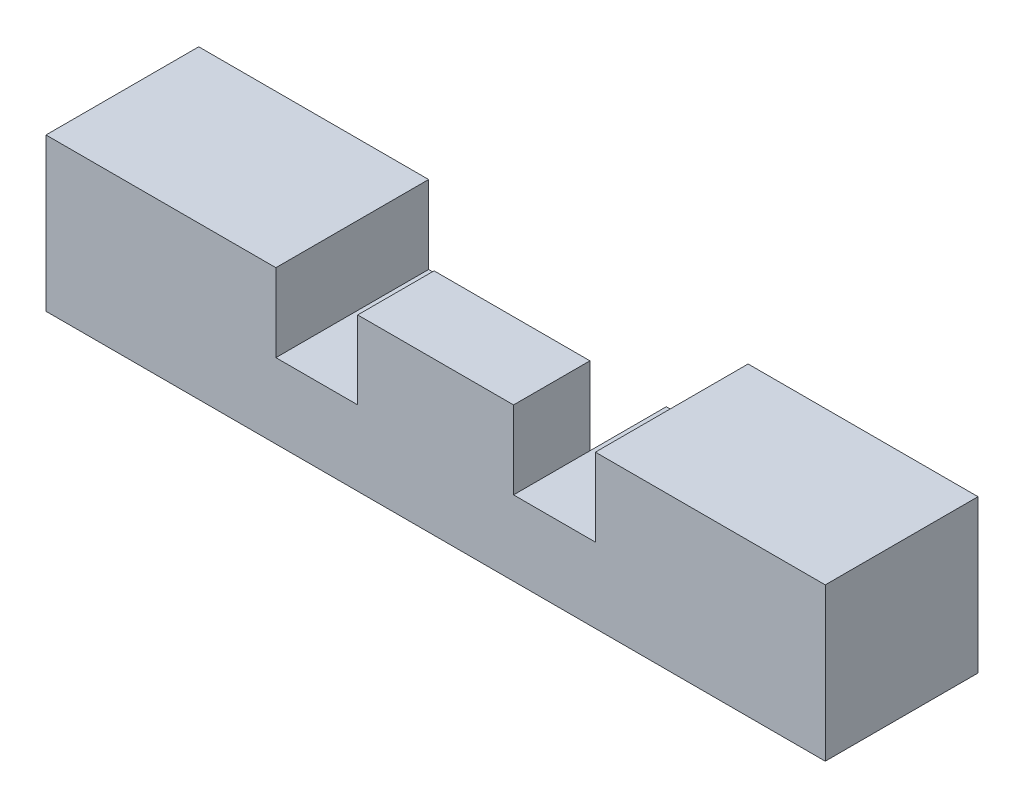
ISO-10303-21;
HEADER;
FILE_DESCRIPTION(('STEP AP214'),'2;1');
FILE_NAME('part.step','',(''),(''),'','','');
FILE_SCHEMA(('AUTOMOTIVE_DESIGN { 1 0 10303 214 1 1 1 1 }'));
ENDSEC;
DATA;
#1=APPLICATION_CONTEXT('core data for automotive mechanical design processes');
#2=APPLICATION_PROTOCOL_DEFINITION('international standard','automotive_design',2000,#1);
#3=PRODUCT_CONTEXT('',#1,'mechanical');
#4=PRODUCT('Part','Part','',(#3));
#5=PRODUCT_RELATED_PRODUCT_CATEGORY('part','',(#4));
#6=PRODUCT_DEFINITION_FORMATION('','',#4);
#7=PRODUCT_DEFINITION_CONTEXT('part definition',#1,'design');
#8=PRODUCT_DEFINITION('design','',#6,#7);
#9=PRODUCT_DEFINITION_SHAPE('','',#8);
#10=(LENGTH_UNIT() NAMED_UNIT(*) SI_UNIT(.MILLI.,.METRE.));
#11=(NAMED_UNIT(*) PLANE_ANGLE_UNIT() SI_UNIT($,.RADIAN.));
#12=(NAMED_UNIT(*) SI_UNIT($,.STERADIAN.) SOLID_ANGLE_UNIT());
#13=UNCERTAINTY_MEASURE_WITH_UNIT(LENGTH_MEASURE(1.E-05),#10,'distance_accuracy_value','');
#14=(GEOMETRIC_REPRESENTATION_CONTEXT(3) GLOBAL_UNCERTAINTY_ASSIGNED_CONTEXT((#13)) GLOBAL_UNIT_ASSIGNED_CONTEXT((#10,
#11,#12)) REPRESENTATION_CONTEXT('',''));
#15=CARTESIAN_POINT('',(0.,0.,0.));
#16=DIRECTION('',(0.,0.,1.));
#17=DIRECTION('',(1.,0.,0.));
#18=AXIS2_PLACEMENT_3D('',#15,#16,#17);
#19=CARTESIAN_POINT('',(-50.,9.8,19.6));
#20=DIRECTION('',(1.,0.,0.));
#21=DIRECTION('',(0.,0.,-1.));
#22=AXIS2_PLACEMENT_3D('',#19,#20,#21);
#23=PLANE('',#22);
#24=DIRECTION('',(0.,-1.,0.));
#25=VECTOR('',#24,1.);
#26=CARTESIAN_POINT('',(-50.,9.8,0.));
#27=LINE('',#26,#25);
#28=CARTESIAN_POINT('',(-50.,9.8,0.));
#29=VERTEX_POINT('',#28);
#30=CARTESIAN_POINT('',(-50.,-9.8,0.));
#31=VERTEX_POINT('',#30);
#32=EDGE_CURVE('E463',#29,#31,#27,.T.);
#33=ORIENTED_EDGE('',*,*,#32,.T.);
#34=DIRECTION('',(0.,0.,-1.));
#35=VECTOR('',#34,1.);
#36=CARTESIAN_POINT('',(-50.,-9.8,19.6));
#37=LINE('',#36,#35);
#38=CARTESIAN_POINT('',(-50.,-9.8,19.6));
#39=VERTEX_POINT('',#38);
#40=EDGE_CURVE('E470',#39,#31,#37,.T.);
#41=ORIENTED_EDGE('',*,*,#40,.F.);
#42=DIRECTION('',(0.,-1.,0.));
#43=VECTOR('',#42,1.);
#44=CARTESIAN_POINT('',(-50.,9.8,19.6));
#45=LINE('',#44,#43);
#46=CARTESIAN_POINT('',(-50.,9.8,19.6));
#47=VERTEX_POINT('',#46);
#48=EDGE_CURVE('E452',#47,#39,#45,.T.);
#49=ORIENTED_EDGE('',*,*,#48,.F.);
#50=DIRECTION('',(0.,0.,-1.));
#51=VECTOR('',#50,1.);
#52=CARTESIAN_POINT('',(-50.,9.8,19.6));
#53=LINE('',#52,#51);
#54=EDGE_CURVE('E473',#47,#29,#53,.T.);
#55=ORIENTED_EDGE('',*,*,#54,.T.);
#56=EDGE_LOOP('',(#33,#41,#49,#55));
#57=FACE_BOUND('',#56,.T.);
#58=ADVANCED_FACE('F34',(#57),#23,.F.);
#59=CARTESIAN_POINT('',(0.,-0.199999999999999,0.));
#60=DIRECTION('',(0.,-1.,0.));
#61=DIRECTION('',(0.,0.,-1.));
#62=AXIS2_PLACEMENT_3D('',#59,#60,#61);
#63=PLANE('',#62);
#64=DIRECTION('',(0.,0.,1.));
#65=VECTOR('',#64,1.);
#66=CARTESIAN_POINT('',(-10.,-0.199999999999999,9.8));
#67=LINE('',#66,#65);
#68=CARTESIAN_POINT('',(-10.,-0.199999999999999,9.8));
#69=VERTEX_POINT('',#68);
#70=CARTESIAN_POINT('',(-10.,-0.199999999999999,19.6));
#71=VERTEX_POINT('',#70);
#72=EDGE_CURVE('E370',#69,#71,#67,.T.);
#73=ORIENTED_EDGE('',*,*,#72,.F.);
#74=DIRECTION('',(0.,0.,-1.));
#75=VECTOR('',#74,1.);
#76=CARTESIAN_POINT('',(-10.,-0.199999999999999,0.));
#77=LINE('',#76,#75);
#78=CARTESIAN_POINT('',(-10.,-0.199999999999999,0.));
#79=VERTEX_POINT('',#78);
#80=EDGE_CURVE('E11',#69,#79,#77,.T.);
#81=ORIENTED_EDGE('',*,*,#80,.T.);
#82=DIRECTION('',(-1.,0.,0.));
#83=VECTOR('',#82,1.);
#84=CARTESIAN_POINT('',(20.5,-0.199999999999999,0.));
#85=LINE('',#84,#83);
#86=CARTESIAN_POINT('',(-20.5,-0.199999999999999,0.));
#87=VERTEX_POINT('',#86);
#88=EDGE_CURVE('E427',#79,#87,#85,.T.);
#89=ORIENTED_EDGE('',*,*,#88,.T.);
#90=DIRECTION('',(0.,0.,1.));
#91=VECTOR('',#90,1.);
#92=CARTESIAN_POINT('',(-20.5,-0.199999999999999,0.));
#93=LINE('',#92,#91);
#94=CARTESIAN_POINT('',(-20.5,-0.199999999999999,19.6));
#95=VERTEX_POINT('',#94);
#96=EDGE_CURVE('E417',#87,#95,#93,.T.);
#97=ORIENTED_EDGE('',*,*,#96,.T.);
#98=DIRECTION('',(1.,0.,0.));
#99=VECTOR('',#98,1.);
#100=CARTESIAN_POINT('',(20.5,-0.199999999999999,19.6));
#101=LINE('',#100,#99);
#102=EDGE_CURVE('E422',#95,#71,#101,.T.);
#103=ORIENTED_EDGE('',*,*,#102,.T.);
#104=EDGE_LOOP('',(#73,#81,#89,#97,#103));
#105=FACE_BOUND('',#104,.T.);
#106=ADVANCED_FACE('F528',(#105),#63,.F.);
#107=DIRECTION('',(0.,0.,-1.));
#108=VECTOR('',#107,1.);
#109=CARTESIAN_POINT('',(10.,-0.199999999999999,9.8));
#110=LINE('',#109,#108);
#111=CARTESIAN_POINT('',(10.,-0.199999999999999,19.6));
#112=VERTEX_POINT('',#111);
#113=CARTESIAN_POINT('',(10.,-0.199999999999999,9.8));
#114=VERTEX_POINT('',#113);
#115=EDGE_CURVE('E375',#112,#114,#110,.T.);
#116=ORIENTED_EDGE('',*,*,#115,.F.);
#117=CARTESIAN_POINT('',(20.5,-0.199999999999999,19.6));
#118=VERTEX_POINT('',#117);
#119=EDGE_CURVE('E420',#112,#118,#101,.T.);
#120=ORIENTED_EDGE('',*,*,#119,.T.);
#121=DIRECTION('',(0.,0.,-1.));
#122=VECTOR('',#121,1.);
#123=CARTESIAN_POINT('',(20.5,-0.199999999999999,0.));
#124=LINE('',#123,#122);
#125=CARTESIAN_POINT('',(20.5,-0.199999999999999,0.));
#126=VERTEX_POINT('',#125);
#127=EDGE_CURVE('E425',#118,#126,#124,.T.);
#128=ORIENTED_EDGE('',*,*,#127,.T.);
#129=CARTESIAN_POINT('',(10.,-0.199999999999999,0.));
#130=VERTEX_POINT('',#129);
#131=EDGE_CURVE('E428',#126,#130,#85,.T.);
#132=ORIENTED_EDGE('',*,*,#131,.T.);
#133=DIRECTION('',(0.,0.,-1.));
#134=VECTOR('',#133,1.);
#135=CARTESIAN_POINT('',(10.,-0.199999999999999,-9.8));
#136=LINE('',#135,#134);
#137=EDGE_CURVE('E393',#114,#130,#136,.T.);
#138=ORIENTED_EDGE('',*,*,#137,.F.);
#139=EDGE_LOOP('',(#116,#120,#128,#132,#138));
#140=FACE_BOUND('',#139,.T.);
#141=ADVANCED_FACE('F517',(#140),#63,.F.);
#142=CARTESIAN_POINT('',(0.,0.,0.));
#143=DIRECTION('',(0.,0.,1.));
#144=DIRECTION('',(1.,0.,0.));
#145=AXIS2_PLACEMENT_3D('',#142,#143,#144);
#146=PLANE('',#145);
#147=DIRECTION('',(1.,0.,0.));
#148=VECTOR('',#147,1.);
#149=CARTESIAN_POINT('',(-50.,-9.8,0.));
#150=LINE('',#149,#148);
#151=CARTESIAN_POINT('',(10.,-9.8,0.));
#152=VERTEX_POINT('',#151);
#153=CARTESIAN_POINT('',(50.,-9.8,0.));
#154=VERTEX_POINT('',#153);
#155=EDGE_CURVE('E465',#152,#154,#150,.T.);
#156=ORIENTED_EDGE('',*,*,#155,.F.);
#157=DIRECTION('',(0.,1.,0.));
#158=VECTOR('',#157,1.);
#159=CARTESIAN_POINT('',(10.,0.,0.));
#160=LINE('',#159,#158);
#161=EDGE_CURVE('E410',#152,#130,#160,.T.);
#162=ORIENTED_EDGE('',*,*,#161,.T.);
#163=ORIENTED_EDGE('',*,*,#131,.F.);
#164=DIRECTION('',(0.,1.,0.));
#165=VECTOR('',#164,1.);
#166=CARTESIAN_POINT('',(20.5,-0.199999999999999,0.));
#167=LINE('',#166,#165);
#168=CARTESIAN_POINT('',(20.5,9.8,0.));
#169=VERTEX_POINT('',#168);
#170=EDGE_CURVE('E437',#126,#169,#167,.T.);
#171=ORIENTED_EDGE('',*,*,#170,.T.);
#172=DIRECTION('',(-1.,0.,0.));
#173=VECTOR('',#172,1.);
#174=CARTESIAN_POINT('',(-50.,9.8,0.));
#175=LINE('',#174,#173);
#176=CARTESIAN_POINT('',(50.,9.8,0.));
#177=VERTEX_POINT('',#176);
#178=EDGE_CURVE('E460',#177,#169,#175,.T.);
#179=ORIENTED_EDGE('',*,*,#178,.F.);
#180=DIRECTION('',(0.,1.,0.));
#181=VECTOR('',#180,1.);
#182=CARTESIAN_POINT('',(50.,9.8,0.));
#183=LINE('',#182,#181);
#184=EDGE_CURVE('E436',#154,#177,#183,.T.);
#185=ORIENTED_EDGE('',*,*,#184,.F.);
#186=EDGE_LOOP('',(#156,#162,#163,#171,#179,#185));
#187=FACE_BOUND('',#186,.T.);
#188=ADVANCED_FACE('F486',(#187),#146,.F.);
#189=CARTESIAN_POINT('',(-50.,9.8,19.6));
#190=DIRECTION('',(0.,-1.,0.));
#191=DIRECTION('',(0.,0.,-1.));
#192=AXIS2_PLACEMENT_3D('',#189,#190,#191);
#193=PLANE('',#192);
#194=DIRECTION('',(-1.,0.,0.));
#195=VECTOR('',#194,1.);
#196=CARTESIAN_POINT('',(-50.,9.8,19.6));
#197=LINE('',#196,#195);
#198=CARTESIAN_POINT('',(-20.5,9.8,19.6));
#199=VERTEX_POINT('',#198);
#200=EDGE_CURVE('E447',#199,#47,#197,.T.);
#201=ORIENTED_EDGE('',*,*,#200,.F.);
#202=DIRECTION('',(0.,0.,1.));
#203=VECTOR('',#202,1.);
#204=CARTESIAN_POINT('',(-20.5,9.8,0.));
#205=LINE('',#204,#203);
#206=CARTESIAN_POINT('',(-20.5,9.8,0.));
#207=VERTEX_POINT('',#206);
#208=EDGE_CURVE('E416',#207,#199,#205,.T.);
#209=ORIENTED_EDGE('',*,*,#208,.F.);
#210=EDGE_CURVE('E459',#207,#29,#175,.T.);
#211=ORIENTED_EDGE('',*,*,#210,.T.);
#212=ORIENTED_EDGE('',*,*,#54,.F.);
#213=EDGE_LOOP('',(#201,#209,#211,#212));
#214=FACE_BOUND('',#213,.T.);
#215=ADVANCED_FACE('F542',(#214),#193,.F.);
#216=CARTESIAN_POINT('',(50.,9.8,19.6));
#217=DIRECTION('',(-1.,0.,0.));
#218=DIRECTION('',(0.,0.,1.));
#219=AXIS2_PLACEMENT_3D('',#216,#217,#218);
#220=PLANE('',#219);
#221=ORIENTED_EDGE('',*,*,#184,.T.);
#222=DIRECTION('',(0.,0.,-1.));
#223=VECTOR('',#222,1.);
#224=CARTESIAN_POINT('',(50.,9.8,19.6));
#225=LINE('',#224,#223);
#226=CARTESIAN_POINT('',(50.,9.8,19.6));
#227=VERTEX_POINT('',#226);
#228=EDGE_CURVE('E43',#227,#177,#225,.T.);
#229=ORIENTED_EDGE('',*,*,#228,.F.);
#230=DIRECTION('',(0.,1.,0.));
#231=VECTOR('',#230,1.);
#232=CARTESIAN_POINT('',(50.,9.8,19.6));
#233=LINE('',#232,#231);
#234=CARTESIAN_POINT('',(50.,-9.8,19.6));
#235=VERTEX_POINT('',#234);
#236=EDGE_CURVE('E444',#235,#227,#233,.T.);
#237=ORIENTED_EDGE('',*,*,#236,.F.);
#238=DIRECTION('',(0.,0.,-1.));
#239=VECTOR('',#238,1.);
#240=CARTESIAN_POINT('',(50.,-9.8,19.6));
#241=LINE('',#240,#239);
#242=EDGE_CURVE('E456',#235,#154,#241,.T.);
#243=ORIENTED_EDGE('',*,*,#242,.T.);
#244=EDGE_LOOP('',(#221,#229,#237,#243));
#245=FACE_BOUND('',#244,.T.);
#246=ADVANCED_FACE('F36',(#245),#220,.F.);
#247=ORIENTED_EDGE('',*,*,#178,.T.);
#248=DIRECTION('',(0.,0.,-1.));
#249=VECTOR('',#248,1.);
#250=CARTESIAN_POINT('',(20.5,9.8,0.));
#251=LINE('',#250,#249);
#252=CARTESIAN_POINT('',(20.5,9.8,19.6));
#253=VERTEX_POINT('',#252);
#254=EDGE_CURVE('E421',#253,#169,#251,.T.);
#255=ORIENTED_EDGE('',*,*,#254,.F.);
#256=EDGE_CURVE('E449',#227,#253,#197,.T.);
#257=ORIENTED_EDGE('',*,*,#256,.F.);
#258=ORIENTED_EDGE('',*,*,#228,.T.);
#259=EDGE_LOOP('',(#247,#255,#257,#258));
#260=FACE_BOUND('',#259,.T.);
#261=ADVANCED_FACE('F478',(#260),#193,.F.);
#262=CARTESIAN_POINT('',(-50.,-9.8,19.6));
#263=DIRECTION('',(0.,1.,0.));
#264=DIRECTION('',(0.,0.,1.));
#265=AXIS2_PLACEMENT_3D('',#262,#263,#264);
#266=PLANE('',#265);
#267=DIRECTION('',(1.,0.,0.));
#268=VECTOR('',#267,1.);
#269=CARTESIAN_POINT('',(-50.,-9.8,9.8));
#270=LINE('',#269,#268);
#271=CARTESIAN_POINT('',(-10.,-9.8,9.8));
#272=VERTEX_POINT('',#271);
#273=CARTESIAN_POINT('',(10.,-9.8,9.8));
#274=VERTEX_POINT('',#273);
#275=EDGE_CURVE('E407',#272,#274,#270,.T.);
#276=ORIENTED_EDGE('',*,*,#275,.T.);
#277=DIRECTION('',(0.,0.,-1.));
#278=VECTOR('',#277,1.);
#279=CARTESIAN_POINT('',(10.,-9.8,19.6));
#280=LINE('',#279,#278);
#281=EDGE_CURVE('E413',#274,#152,#280,.T.);
#282=ORIENTED_EDGE('',*,*,#281,.T.);
#283=ORIENTED_EDGE('',*,*,#155,.T.);
#284=ORIENTED_EDGE('',*,*,#242,.F.);
#285=DIRECTION('',(1.,0.,0.));
#286=VECTOR('',#285,1.);
#287=CARTESIAN_POINT('',(-50.,-9.8,19.6));
#288=LINE('',#287,#286);
#289=EDGE_CURVE('E454',#39,#235,#288,.T.);
#290=ORIENTED_EDGE('',*,*,#289,.F.);
#291=ORIENTED_EDGE('',*,*,#40,.T.);
#292=CARTESIAN_POINT('',(-10.,-9.8,0.));
#293=VERTEX_POINT('',#292);
#294=EDGE_CURVE('E448',#31,#293,#150,.T.);
#295=ORIENTED_EDGE('',*,*,#294,.T.);
#296=DIRECTION('',(0.,0.,1.));
#297=VECTOR('',#296,1.);
#298=CARTESIAN_POINT('',(-10.,-9.8,19.6));
#299=LINE('',#298,#297);
#300=EDGE_CURVE('E404',#293,#272,#299,.T.);
#301=ORIENTED_EDGE('',*,*,#300,.T.);
#302=EDGE_LOOP('',(#276,#282,#283,#284,#290,#291,#295,#301));
#303=FACE_BOUND('',#302,.T.);
#304=ADVANCED_FACE('F500',(#303),#266,.F.);
#305=CARTESIAN_POINT('',(0.,0.,19.6));
#306=DIRECTION('',(0.,0.,1.));
#307=DIRECTION('',(1.,0.,0.));
#308=AXIS2_PLACEMENT_3D('',#305,#306,#307);
#309=PLANE('',#308);
#310=DIRECTION('',(0.,1.,0.));
#311=VECTOR('',#310,1.);
#312=CARTESIAN_POINT('',(-20.5,-0.199999999999999,19.6));
#313=LINE('',#312,#311);
#314=EDGE_CURVE('E431',#95,#199,#313,.T.);
#315=ORIENTED_EDGE('',*,*,#314,.T.);
#316=ORIENTED_EDGE('',*,*,#200,.T.);
#317=ORIENTED_EDGE('',*,*,#48,.T.);
#318=ORIENTED_EDGE('',*,*,#289,.T.);
#319=ORIENTED_EDGE('',*,*,#236,.T.);
#320=ORIENTED_EDGE('',*,*,#256,.T.);
#321=DIRECTION('',(0.,1.,0.));
#322=VECTOR('',#321,1.);
#323=CARTESIAN_POINT('',(20.5,-0.199999999999999,19.6));
#324=LINE('',#323,#322);
#325=EDGE_CURVE('E440',#118,#253,#324,.T.);
#326=ORIENTED_EDGE('',*,*,#325,.F.);
#327=ORIENTED_EDGE('',*,*,#119,.F.);
#328=DIRECTION('',(0.,-1.,0.));
#329=VECTOR('',#328,1.);
#330=CARTESIAN_POINT('',(10.,9.8,19.6));
#331=LINE('',#330,#329);
#332=CARTESIAN_POINT('',(10.,9.8,19.6));
#333=VERTEX_POINT('',#332);
#334=EDGE_CURVE('E389',#333,#112,#331,.T.);
#335=ORIENTED_EDGE('',*,*,#334,.F.);
#336=DIRECTION('',(1.,0.,0.));
#337=VECTOR('',#336,1.);
#338=CARTESIAN_POINT('',(-10.,9.8,19.6));
#339=LINE('',#338,#337);
#340=CARTESIAN_POINT('',(-10.,9.8,19.6));
#341=VERTEX_POINT('',#340);
#342=EDGE_CURVE('E374',#341,#333,#339,.T.);
#343=ORIENTED_EDGE('',*,*,#342,.F.);
#344=DIRECTION('',(0.,-1.,0.));
#345=VECTOR('',#344,1.);
#346=CARTESIAN_POINT('',(-10.,9.8,19.6));
#347=LINE('',#346,#345);
#348=EDGE_CURVE('E391',#341,#71,#347,.T.);
#349=ORIENTED_EDGE('',*,*,#348,.T.);
#350=ORIENTED_EDGE('',*,*,#102,.F.);
#351=EDGE_LOOP('',(#315,#316,#317,#318,#319,#320,#326,#327,#335,#343,#349,#350));
#352=FACE_BOUND('',#351,.T.);
#353=ADVANCED_FACE('F494',(#352),#309,.T.);
#354=ORIENTED_EDGE('',*,*,#88,.F.);
#355=DIRECTION('',(0.,-1.,0.));
#356=VECTOR('',#355,1.);
#357=CARTESIAN_POINT('',(-10.,0.,0.));
#358=LINE('',#357,#356);
#359=EDGE_CURVE('E399',#79,#293,#358,.T.);
#360=ORIENTED_EDGE('',*,*,#359,.T.);
#361=ORIENTED_EDGE('',*,*,#294,.F.);
#362=ORIENTED_EDGE('',*,*,#32,.F.);
#363=ORIENTED_EDGE('',*,*,#210,.F.);
#364=DIRECTION('',(0.,1.,0.));
#365=VECTOR('',#364,1.);
#366=CARTESIAN_POINT('',(-20.5,-0.199999999999999,0.));
#367=LINE('',#366,#365);
#368=EDGE_CURVE('E434',#87,#207,#367,.T.);
#369=ORIENTED_EDGE('',*,*,#368,.F.);
#370=EDGE_LOOP('',(#354,#360,#361,#362,#363,#369));
#371=FACE_BOUND('',#370,.T.);
#372=ADVANCED_FACE('F537',(#371),#146,.F.);
#373=CARTESIAN_POINT('',(-20.5,-0.199999999999999,0.));
#374=DIRECTION('',(-1.,0.,0.));
#375=DIRECTION('',(0.,0.,1.));
#376=AXIS2_PLACEMENT_3D('',#373,#374,#375);
#377=PLANE('',#376);
#378=ORIENTED_EDGE('',*,*,#208,.T.);
#379=ORIENTED_EDGE('',*,*,#314,.F.);
#380=ORIENTED_EDGE('',*,*,#96,.F.);
#381=ORIENTED_EDGE('',*,*,#368,.T.);
#382=EDGE_LOOP('',(#378,#379,#380,#381));
#383=FACE_BOUND('',#382,.T.);
#384=ADVANCED_FACE('F533',(#383),#377,.F.);
#385=CARTESIAN_POINT('',(20.5,-0.199999999999999,0.));
#386=DIRECTION('',(1.,0.,0.));
#387=DIRECTION('',(0.,0.,-1.));
#388=AXIS2_PLACEMENT_3D('',#385,#386,#387);
#389=PLANE('',#388);
#390=ORIENTED_EDGE('',*,*,#254,.T.);
#391=ORIENTED_EDGE('',*,*,#170,.F.);
#392=ORIENTED_EDGE('',*,*,#127,.F.);
#393=ORIENTED_EDGE('',*,*,#325,.T.);
#394=EDGE_LOOP('',(#390,#391,#392,#393));
#395=FACE_BOUND('',#394,.T.);
#396=ADVANCED_FACE('F491',(#395),#389,.F.);
#397=CARTESIAN_POINT('',(10.,-15.7,-9.8));
#398=DIRECTION('',(1.,0.,0.));
#399=DIRECTION('',(0.,0.,-1.));
#400=AXIS2_PLACEMENT_3D('',#397,#398,#399);
#401=PLANE('',#400);
#402=DIRECTION('',(0.,1.,0.));
#403=VECTOR('',#402,1.);
#404=CARTESIAN_POINT('',(10.,-15.7,9.8));
#405=LINE('',#404,#403);
#406=EDGE_CURVE('E396',#274,#114,#405,.T.);
#407=ORIENTED_EDGE('',*,*,#406,.T.);
#408=ORIENTED_EDGE('',*,*,#137,.T.);
#409=ORIENTED_EDGE('',*,*,#161,.F.);
#410=ORIENTED_EDGE('',*,*,#281,.F.);
#411=EDGE_LOOP('',(#407,#408,#409,#410));
#412=FACE_BOUND('',#411,.T.);
#413=ADVANCED_FACE('F503',(#412),#401,.F.);
#414=CARTESIAN_POINT('',(-10.,-15.7,9.8));
#415=DIRECTION('',(0.,0.,1.));
#416=DIRECTION('',(1.,0.,0.));
#417=AXIS2_PLACEMENT_3D('',#414,#415,#416);
#418=PLANE('',#417);
#419=DIRECTION('',(0.,1.,0.));
#420=VECTOR('',#419,1.);
#421=CARTESIAN_POINT('',(-10.,-15.7,9.8));
#422=LINE('',#421,#420);
#423=EDGE_CURVE('E395',#272,#69,#422,.T.);
#424=ORIENTED_EDGE('',*,*,#423,.T.);
#425=DIRECTION('',(0.,-1.,0.));
#426=VECTOR('',#425,1.);
#427=CARTESIAN_POINT('',(-10.,9.8,9.8));
#428=LINE('',#427,#426);
#429=CARTESIAN_POINT('',(-10.,9.8,9.8));
#430=VERTEX_POINT('',#429);
#431=EDGE_CURVE('E381',#430,#69,#428,.T.);
#432=ORIENTED_EDGE('',*,*,#431,.F.);
#433=DIRECTION('',(-1.,0.,0.));
#434=VECTOR('',#433,1.);
#435=CARTESIAN_POINT('',(-10.,9.8,9.8));
#436=LINE('',#435,#434);
#437=CARTESIAN_POINT('',(10.,9.8,9.8));
#438=VERTEX_POINT('',#437);
#439=EDGE_CURVE('E379',#438,#430,#436,.T.);
#440=ORIENTED_EDGE('',*,*,#439,.F.);
#441=DIRECTION('',(0.,-1.,0.));
#442=VECTOR('',#441,1.);
#443=CARTESIAN_POINT('',(10.,9.8,9.8));
#444=LINE('',#443,#442);
#445=EDGE_CURVE('E387',#438,#114,#444,.T.);
#446=ORIENTED_EDGE('',*,*,#445,.T.);
#447=ORIENTED_EDGE('',*,*,#406,.F.);
#448=ORIENTED_EDGE('',*,*,#275,.F.);
#449=EDGE_LOOP('',(#424,#432,#440,#446,#447,#448));
#450=FACE_BOUND('',#449,.T.);
#451=ADVANCED_FACE('F506',(#450),#418,.F.);
#452=CARTESIAN_POINT('',(-10.,-15.7,-9.8));
#453=DIRECTION('',(-1.,0.,0.));
#454=DIRECTION('',(0.,0.,1.));
#455=AXIS2_PLACEMENT_3D('',#452,#453,#454);
#456=PLANE('',#455);
#457=ORIENTED_EDGE('',*,*,#359,.F.);
#458=ORIENTED_EDGE('',*,*,#80,.F.);
#459=ORIENTED_EDGE('',*,*,#423,.F.);
#460=ORIENTED_EDGE('',*,*,#300,.F.);
#461=EDGE_LOOP('',(#457,#458,#459,#460));
#462=FACE_BOUND('',#461,.T.);
#463=ADVANCED_FACE('F546',(#462),#456,.F.);
#464=CARTESIAN_POINT('',(-10.,9.8,9.8));
#465=DIRECTION('',(1.,0.,0.));
#466=DIRECTION('',(0.,0.,-1.));
#467=AXIS2_PLACEMENT_3D('',#464,#465,#466);
#468=PLANE('',#467);
#469=ORIENTED_EDGE('',*,*,#72,.T.);
#470=ORIENTED_EDGE('',*,*,#348,.F.);
#471=DIRECTION('',(0.,0.,1.));
#472=VECTOR('',#471,1.);
#473=CARTESIAN_POINT('',(-10.,9.8,9.8));
#474=LINE('',#473,#472);
#475=EDGE_CURVE('E371',#430,#341,#474,.T.);
#476=ORIENTED_EDGE('',*,*,#475,.F.);
#477=ORIENTED_EDGE('',*,*,#431,.T.);
#478=EDGE_LOOP('',(#469,#470,#476,#477));
#479=FACE_BOUND('',#478,.T.);
#480=ADVANCED_FACE('F523',(#479),#468,.F.);
#481=CARTESIAN_POINT('',(10.,9.8,9.8));
#482=DIRECTION('',(-1.,0.,0.));
#483=DIRECTION('',(0.,0.,1.));
#484=AXIS2_PLACEMENT_3D('',#481,#482,#483);
#485=PLANE('',#484);
#486=ORIENTED_EDGE('',*,*,#115,.T.);
#487=ORIENTED_EDGE('',*,*,#445,.F.);
#488=DIRECTION('',(0.,0.,-1.));
#489=VECTOR('',#488,1.);
#490=CARTESIAN_POINT('',(10.,9.8,9.8));
#491=LINE('',#490,#489);
#492=EDGE_CURVE('E377',#333,#438,#491,.T.);
#493=ORIENTED_EDGE('',*,*,#492,.F.);
#494=ORIENTED_EDGE('',*,*,#334,.T.);
#495=EDGE_LOOP('',(#486,#487,#493,#494));
#496=FACE_BOUND('',#495,.T.);
#497=ADVANCED_FACE('F514',(#496),#485,.F.);
#498=CARTESIAN_POINT('',(0.,9.8,0.));
#499=DIRECTION('',(0.,1.,0.));
#500=DIRECTION('',(0.,0.,1.));
#501=AXIS2_PLACEMENT_3D('',#498,#499,#500);
#502=PLANE('',#501);
#503=ORIENTED_EDGE('',*,*,#475,.T.);
#504=ORIENTED_EDGE('',*,*,#342,.T.);
#505=ORIENTED_EDGE('',*,*,#492,.T.);
#506=ORIENTED_EDGE('',*,*,#439,.T.);
#507=EDGE_LOOP('',(#503,#504,#505,#506));
#508=FACE_BOUND('',#507,.T.);
#509=ADVANCED_FACE('F519',(#508),#502,.T.);
#510=CLOSED_SHELL('',(#58,#106,#141,#188,#215,#246,#261,#304,#353,#372,#384,#396,#413,#451,#463,
#480,#497,#509));
#511=CARTESIAN_POINT('',(-49.5,0.,0.));
#512=DIRECTION('',(1.,0.,0.));
#513=DIRECTION('',(0.,0.,-1.));
#514=AXIS2_PLACEMENT_3D('',#511,#512,#513);
#515=PLANE('',#514);
#516=DIRECTION('',(0.,1.,0.));
#517=VECTOR('',#516,1.);
#518=CARTESIAN_POINT('',(-49.5,7.8,17.6));
#519=LINE('',#518,#517);
#520=CARTESIAN_POINT('',(-49.5,-7.8,17.6));
#521=VERTEX_POINT('',#520);
#522=CARTESIAN_POINT('',(-49.5,7.8,17.6));
#523=VERTEX_POINT('',#522);
#524=EDGE_CURVE('E50',#521,#523,#519,.T.);
#525=ORIENTED_EDGE('',*,*,#524,.F.);
#526=DIRECTION('',(0.,0.,1.));
#527=VECTOR('',#526,1.);
#528=CARTESIAN_POINT('',(-49.5,-7.80000000000001,17.6));
#529=LINE('',#528,#527);
#530=CARTESIAN_POINT('',(-49.5,-7.8,2.));
#531=VERTEX_POINT('',#530);
#532=EDGE_CURVE('E58',#531,#521,#529,.T.);
#533=ORIENTED_EDGE('',*,*,#532,.F.);
#534=DIRECTION('',(0.,-1.,0.));
#535=VECTOR('',#534,1.);
#536=CARTESIAN_POINT('',(-49.5,7.8,2.));
#537=LINE('',#536,#535);
#538=CARTESIAN_POINT('',(-49.5,7.8,2.));
#539=VERTEX_POINT('',#538);
#540=EDGE_CURVE('E243',#539,#531,#537,.T.);
#541=ORIENTED_EDGE('',*,*,#540,.F.);
#542=DIRECTION('',(0.,0.,-1.));
#543=VECTOR('',#542,1.);
#544=CARTESIAN_POINT('',(-49.5,7.8,17.6));
#545=LINE('',#544,#543);
#546=EDGE_CURVE('E252',#523,#539,#545,.T.);
#547=ORIENTED_EDGE('',*,*,#546,.F.);
#548=EDGE_LOOP('',(#525,#533,#541,#547));
#549=FACE_BOUND('',#548,.T.);
#550=ADVANCED_FACE('F257',(#549),#515,.T.);
#551=CARTESIAN_POINT('',(-10.,-15.7,11.8));
#552=DIRECTION('',(0.,0.,1.));
#553=DIRECTION('',(1.,0.,0.));
#554=AXIS2_PLACEMENT_3D('',#551,#552,#553);
#555=PLANE('',#554);
#556=DIRECTION('',(0.,1.,0.));
#557=VECTOR('',#556,1.);
#558=CARTESIAN_POINT('',(-12.,-15.7,11.8));
#559=LINE('',#558,#557);
#560=CARTESIAN_POINT('',(-12.,-7.8,11.8));
#561=VERTEX_POINT('',#560);
#562=CARTESIAN_POINT('',(-12.,-2.2,11.8));
#563=VERTEX_POINT('',#562);
#564=EDGE_CURVE('E317',#561,#563,#559,.T.);
#565=ORIENTED_EDGE('',*,*,#564,.F.);
#566=DIRECTION('',(1.,0.,0.));
#567=VECTOR('',#566,1.);
#568=CARTESIAN_POINT('',(-50.,-7.8,11.8));
#569=LINE('',#568,#567);
#570=CARTESIAN_POINT('',(12.,-7.8,11.8));
#571=VERTEX_POINT('',#570);
#572=EDGE_CURVE('E324',#561,#571,#569,.T.);
#573=ORIENTED_EDGE('',*,*,#572,.T.);
#574=DIRECTION('',(0.,1.,0.));
#575=VECTOR('',#574,1.);
#576=CARTESIAN_POINT('',(12.,-15.7,11.8));
#577=LINE('',#576,#575);
#578=CARTESIAN_POINT('',(12.,-2.2,11.8));
#579=VERTEX_POINT('',#578);
#580=EDGE_CURVE('E347',#571,#579,#577,.T.);
#581=ORIENTED_EDGE('',*,*,#580,.T.);
#582=DIRECTION('',(1.,0.,0.));
#583=VECTOR('',#582,1.);
#584=CARTESIAN_POINT('',(-10.,-2.2,11.8));
#585=LINE('',#584,#583);
#586=CARTESIAN_POINT('',(8.,-2.2,11.8));
#587=VERTEX_POINT('',#586);
#588=EDGE_CURVE('E367',#587,#579,#585,.T.);
#589=ORIENTED_EDGE('',*,*,#588,.F.);
#590=DIRECTION('',(0.,-1.,0.));
#591=VECTOR('',#590,1.);
#592=CARTESIAN_POINT('',(8.,-15.7,11.8));
#593=LINE('',#592,#591);
#594=CARTESIAN_POINT('',(8.,7.8,11.8));
#595=VERTEX_POINT('',#594);
#596=EDGE_CURVE('E304',#595,#587,#593,.T.);
#597=ORIENTED_EDGE('',*,*,#596,.F.);
#598=DIRECTION('',(-1.,0.,0.));
#599=VECTOR('',#598,1.);
#600=CARTESIAN_POINT('',(-10.,7.8,11.8));
#601=LINE('',#600,#599);
#602=CARTESIAN_POINT('',(-8.,7.8,11.8));
#603=VERTEX_POINT('',#602);
#604=EDGE_CURVE('E356',#595,#603,#601,.T.);
#605=ORIENTED_EDGE('',*,*,#604,.T.);
#606=DIRECTION('',(0.,-1.,0.));
#607=VECTOR('',#606,1.);
#608=CARTESIAN_POINT('',(-8.,9.8,11.8));
#609=LINE('',#608,#607);
#610=CARTESIAN_POINT('',(-8.,-2.2,11.8));
#611=VERTEX_POINT('',#610);
#612=EDGE_CURVE('E353',#603,#611,#609,.T.);
#613=ORIENTED_EDGE('',*,*,#612,.T.);
#614=DIRECTION('',(1.,0.,0.));
#615=VECTOR('',#614,1.);
#616=CARTESIAN_POINT('',(-10.,-2.2,11.8));
#617=LINE('',#616,#615);
#618=EDGE_CURVE('E269',#563,#611,#617,.T.);
#619=ORIENTED_EDGE('',*,*,#618,.F.);
#620=EDGE_LOOP('',(#565,#573,#581,#589,#597,#605,#613,#619));
#621=FACE_BOUND('',#620,.T.);
#622=ADVANCED_FACE('F716',(#621),#555,.T.);
#623=CARTESIAN_POINT('',(12.,-15.7,-9.8));
#624=DIRECTION('',(1.,0.,0.));
#625=DIRECTION('',(0.,0.,-1.));
#626=AXIS2_PLACEMENT_3D('',#623,#624,#625);
#627=PLANE('',#626);
#628=ORIENTED_EDGE('',*,*,#580,.F.);
#629=DIRECTION('',(0.,0.,-1.));
#630=VECTOR('',#629,1.);
#631=CARTESIAN_POINT('',(12.,-7.8,19.6));
#632=LINE('',#631,#630);
#633=CARTESIAN_POINT('',(12.,-7.8,2.));
#634=VERTEX_POINT('',#633);
#635=EDGE_CURVE('E323',#571,#634,#632,.T.);
#636=ORIENTED_EDGE('',*,*,#635,.T.);
#637=DIRECTION('',(0.,1.,0.));
#638=VECTOR('',#637,1.);
#639=CARTESIAN_POINT('',(12.,0.,2.));
#640=LINE('',#639,#638);
#641=CARTESIAN_POINT('',(12.,-2.2,2.));
#642=VERTEX_POINT('',#641);
#643=EDGE_CURVE('E320',#634,#642,#640,.T.);
#644=ORIENTED_EDGE('',*,*,#643,.T.);
#645=DIRECTION('',(0.,0.,-1.));
#646=VECTOR('',#645,1.);
#647=CARTESIAN_POINT('',(12.,-2.2,-9.8));
#648=LINE('',#647,#646);
#649=EDGE_CURVE('E310',#579,#642,#648,.T.);
#650=ORIENTED_EDGE('',*,*,#649,.F.);
#651=EDGE_LOOP('',(#628,#636,#644,#650));
#652=FACE_BOUND('',#651,.T.);
#653=ADVANCED_FACE('F666',(#652),#627,.T.);
#654=CARTESIAN_POINT('',(0.,0.,2.));
#655=DIRECTION('',(0.,0.,1.));
#656=DIRECTION('',(1.,0.,0.));
#657=AXIS2_PLACEMENT_3D('',#654,#655,#656);
#658=PLANE('',#657);
#659=DIRECTION('',(1.,0.,0.));
#660=VECTOR('',#659,1.);
#661=CARTESIAN_POINT('',(-50.,-7.8,2.));
#662=LINE('',#661,#660);
#663=CARTESIAN_POINT('',(48.,-7.8,2.));
#664=VERTEX_POINT('',#663);
#665=EDGE_CURVE('E318',#634,#664,#662,.T.);
#666=ORIENTED_EDGE('',*,*,#665,.T.);
#667=DIRECTION('',(0.,1.,0.));
#668=VECTOR('',#667,1.);
#669=CARTESIAN_POINT('',(48.,9.8,2.));
#670=LINE('',#669,#668);
#671=CARTESIAN_POINT('',(48.,7.8,2.));
#672=VERTEX_POINT('',#671);
#673=EDGE_CURVE('E249',#664,#672,#670,.T.);
#674=ORIENTED_EDGE('',*,*,#673,.T.);
#675=DIRECTION('',(-1.,0.,0.));
#676=VECTOR('',#675,1.);
#677=CARTESIAN_POINT('',(-50.,7.8,2.));
#678=LINE('',#677,#676);
#679=CARTESIAN_POINT('',(22.5,7.8,2.));
#680=VERTEX_POINT('',#679);
#681=EDGE_CURVE('E248',#672,#680,#678,.T.);
#682=ORIENTED_EDGE('',*,*,#681,.T.);
#683=DIRECTION('',(0.,1.,0.));
#684=VECTOR('',#683,1.);
#685=CARTESIAN_POINT('',(22.5,0.,2.));
#686=LINE('',#685,#684);
#687=CARTESIAN_POINT('',(22.5,-2.2,2.));
#688=VERTEX_POINT('',#687);
#689=EDGE_CURVE('E299',#688,#680,#686,.T.);
#690=ORIENTED_EDGE('',*,*,#689,.F.);
#691=DIRECTION('',(-1.,0.,0.));
#692=VECTOR('',#691,1.);
#693=CARTESIAN_POINT('',(0.,-2.2,2.));
#694=LINE('',#693,#692);
#695=EDGE_CURVE('E273',#688,#642,#694,.T.);
#696=ORIENTED_EDGE('',*,*,#695,.T.);
#697=ORIENTED_EDGE('',*,*,#643,.F.);
#698=EDGE_LOOP('',(#666,#674,#682,#690,#696,#697));
#699=FACE_BOUND('',#698,.T.);
#700=ADVANCED_FACE('F661',(#699),#658,.T.);
#701=CARTESIAN_POINT('',(48.,9.8,19.6));
#702=DIRECTION('',(-1.,0.,0.));
#703=DIRECTION('',(0.,0.,1.));
#704=AXIS2_PLACEMENT_3D('',#701,#702,#703);
#705=PLANE('',#704);
#706=ORIENTED_EDGE('',*,*,#673,.F.);
#707=DIRECTION('',(0.,0.,-1.));
#708=VECTOR('',#707,1.);
#709=CARTESIAN_POINT('',(48.,-7.8,19.6));
#710=LINE('',#709,#708);
#711=CARTESIAN_POINT('',(48.,-7.8,17.6));
#712=VERTEX_POINT('',#711);
#713=EDGE_CURVE('E292',#712,#664,#710,.T.);
#714=ORIENTED_EDGE('',*,*,#713,.F.);
#715=DIRECTION('',(0.,1.,0.));
#716=VECTOR('',#715,1.);
#717=CARTESIAN_POINT('',(48.,9.8,17.6));
#718=LINE('',#717,#716);
#719=CARTESIAN_POINT('',(48.,7.8,17.6));
#720=VERTEX_POINT('',#719);
#721=EDGE_CURVE('E289',#712,#720,#718,.T.);
#722=ORIENTED_EDGE('',*,*,#721,.T.);
#723=DIRECTION('',(0.,0.,-1.));
#724=VECTOR('',#723,1.);
#725=CARTESIAN_POINT('',(48.,7.8,19.6));
#726=LINE('',#725,#724);
#727=EDGE_CURVE('E270',#720,#672,#726,.T.);
#728=ORIENTED_EDGE('',*,*,#727,.T.);
#729=EDGE_LOOP('',(#706,#714,#722,#728));
#730=FACE_BOUND('',#729,.T.);
#731=ADVANCED_FACE('F665',(#730),#705,.T.);
#732=CARTESIAN_POINT('',(-50.,7.8,19.6));
#733=DIRECTION('',(0.,-1.,0.));
#734=DIRECTION('',(0.,0.,-1.));
#735=AXIS2_PLACEMENT_3D('',#732,#733,#734);
#736=PLANE('',#735);
#737=ORIENTED_EDGE('',*,*,#681,.F.);
#738=ORIENTED_EDGE('',*,*,#727,.F.);
#739=DIRECTION('',(-1.,0.,0.));
#740=VECTOR('',#739,1.);
#741=CARTESIAN_POINT('',(-50.,7.8,17.6));
#742=LINE('',#741,#740);
#743=CARTESIAN_POINT('',(22.5,7.8,17.6));
#744=VERTEX_POINT('',#743);
#745=EDGE_CURVE('E288',#720,#744,#742,.T.);
#746=ORIENTED_EDGE('',*,*,#745,.T.);
#747=DIRECTION('',(0.,0.,-1.));
#748=VECTOR('',#747,1.);
#749=CARTESIAN_POINT('',(22.5,7.8,0.));
#750=LINE('',#749,#748);
#751=EDGE_CURVE('E279',#744,#680,#750,.T.);
#752=ORIENTED_EDGE('',*,*,#751,.T.);
#753=EDGE_LOOP('',(#737,#738,#746,#752));
#754=FACE_BOUND('',#753,.T.);
#755=ADVANCED_FACE('F678',(#754),#736,.T.);
#756=CARTESIAN_POINT('',(22.5,-0.199999999999999,0.));
#757=DIRECTION('',(1.,0.,0.));
#758=DIRECTION('',(0.,0.,-1.));
#759=AXIS2_PLACEMENT_3D('',#756,#757,#758);
#760=PLANE('',#759);
#761=ORIENTED_EDGE('',*,*,#751,.F.);
#762=DIRECTION('',(0.,1.,0.));
#763=VECTOR('',#762,1.);
#764=CARTESIAN_POINT('',(22.5,0.,17.6));
#765=LINE('',#764,#763);
#766=CARTESIAN_POINT('',(22.5,-2.2,17.6));
#767=VERTEX_POINT('',#766);
#768=EDGE_CURVE('E286',#767,#744,#765,.T.);
#769=ORIENTED_EDGE('',*,*,#768,.F.);
#770=DIRECTION('',(0.,0.,-1.));
#771=VECTOR('',#770,1.);
#772=CARTESIAN_POINT('',(22.5,-2.2,0.));
#773=LINE('',#772,#771);
#774=EDGE_CURVE('E274',#767,#688,#773,.T.);
#775=ORIENTED_EDGE('',*,*,#774,.T.);
#776=ORIENTED_EDGE('',*,*,#689,.T.);
#777=EDGE_LOOP('',(#761,#769,#775,#776));
#778=FACE_BOUND('',#777,.T.);
#779=ADVANCED_FACE('F653',(#778),#760,.T.);
#780=CARTESIAN_POINT('',(0.,-2.2,0.));
#781=DIRECTION('',(0.,-1.,0.));
#782=DIRECTION('',(0.,0.,-1.));
#783=AXIS2_PLACEMENT_3D('',#780,#781,#782);
#784=PLANE('',#783);
#785=DIRECTION('',(0.,0.,-1.));
#786=VECTOR('',#785,1.);
#787=CARTESIAN_POINT('',(8.00000000000001,-2.2,0.));
#788=LINE('',#787,#786);
#789=CARTESIAN_POINT('',(8.,-2.2,17.6));
#790=VERTEX_POINT('',#789);
#791=EDGE_CURVE('E265',#790,#587,#788,.T.);
#792=ORIENTED_EDGE('',*,*,#791,.T.);
#793=ORIENTED_EDGE('',*,*,#588,.T.);
#794=ORIENTED_EDGE('',*,*,#649,.T.);
#795=ORIENTED_EDGE('',*,*,#695,.F.);
#796=ORIENTED_EDGE('',*,*,#774,.F.);
#797=DIRECTION('',(1.,0.,0.));
#798=VECTOR('',#797,1.);
#799=CARTESIAN_POINT('',(0.,-2.2,17.6));
#800=LINE('',#799,#798);
#801=EDGE_CURVE('E278',#790,#767,#800,.T.);
#802=ORIENTED_EDGE('',*,*,#801,.F.);
#803=EDGE_LOOP('',(#792,#793,#794,#795,#796,#802));
#804=FACE_BOUND('',#803,.T.);
#805=ADVANCED_FACE('F641',(#804),#784,.T.);
#806=CARTESIAN_POINT('',(8.,9.8,9.8));
#807=DIRECTION('',(-1.,0.,0.));
#808=DIRECTION('',(0.,0.,1.));
#809=AXIS2_PLACEMENT_3D('',#806,#807,#808);
#810=PLANE('',#809);
#811=ORIENTED_EDGE('',*,*,#791,.F.);
#812=DIRECTION('',(0.,-1.,0.));
#813=VECTOR('',#812,1.);
#814=CARTESIAN_POINT('',(8.,0.,17.6));
#815=LINE('',#814,#813);
#816=CARTESIAN_POINT('',(8.,7.8,17.6));
#817=VERTEX_POINT('',#816);
#818=EDGE_CURVE('E301',#817,#790,#815,.T.);
#819=ORIENTED_EDGE('',*,*,#818,.F.);
#820=DIRECTION('',(0.,0.,-1.));
#821=VECTOR('',#820,1.);
#822=CARTESIAN_POINT('',(8.,7.8,9.8));
#823=LINE('',#822,#821);
#824=EDGE_CURVE('E307',#817,#595,#823,.T.);
#825=ORIENTED_EDGE('',*,*,#824,.T.);
#826=ORIENTED_EDGE('',*,*,#596,.T.);
#827=EDGE_LOOP('',(#811,#819,#825,#826));
#828=FACE_BOUND('',#827,.T.);
#829=ADVANCED_FACE('F652',(#828),#810,.T.);
#830=CARTESIAN_POINT('',(0.,7.8,0.));
#831=DIRECTION('',(0.,1.,0.));
#832=DIRECTION('',(0.,0.,1.));
#833=AXIS2_PLACEMENT_3D('',#830,#831,#832);
#834=PLANE('',#833);
#835=DIRECTION('',(0.,0.,1.));
#836=VECTOR('',#835,1.);
#837=CARTESIAN_POINT('',(-8.,7.8,9.8));
#838=LINE('',#837,#836);
#839=CARTESIAN_POINT('',(-8.,7.8,17.6));
#840=VERTEX_POINT('',#839);
#841=EDGE_CURVE('E308',#603,#840,#838,.T.);
#842=ORIENTED_EDGE('',*,*,#841,.F.);
#843=ORIENTED_EDGE('',*,*,#604,.F.);
#844=ORIENTED_EDGE('',*,*,#824,.F.);
#845=DIRECTION('',(1.,0.,0.));
#846=VECTOR('',#845,1.);
#847=CARTESIAN_POINT('',(0.,7.8,17.6));
#848=LINE('',#847,#846);
#849=EDGE_CURVE('E305',#840,#817,#848,.T.);
#850=ORIENTED_EDGE('',*,*,#849,.F.);
#851=EDGE_LOOP('',(#842,#843,#844,#850));
#852=FACE_BOUND('',#851,.T.);
#853=ADVANCED_FACE('F744',(#852),#834,.F.);
#854=CARTESIAN_POINT('',(-8.,9.8,9.8));
#855=DIRECTION('',(1.,0.,0.));
#856=DIRECTION('',(0.,0.,-1.));
#857=AXIS2_PLACEMENT_3D('',#854,#855,#856);
#858=PLANE('',#857);
#859=DIRECTION('',(0.,0.,1.));
#860=VECTOR('',#859,1.);
#861=CARTESIAN_POINT('',(-8.,-2.2,0.));
#862=LINE('',#861,#860);
#863=CARTESIAN_POINT('',(-8.,-2.2,17.6));
#864=VERTEX_POINT('',#863);
#865=EDGE_CURVE('E259',#611,#864,#862,.T.);
#866=ORIENTED_EDGE('',*,*,#865,.F.);
#867=ORIENTED_EDGE('',*,*,#612,.F.);
#868=ORIENTED_EDGE('',*,*,#841,.T.);
#869=DIRECTION('',(0.,-1.,0.));
#870=VECTOR('',#869,1.);
#871=CARTESIAN_POINT('',(-8.,9.8,17.6));
#872=LINE('',#871,#870);
#873=EDGE_CURVE('E303',#840,#864,#872,.T.);
#874=ORIENTED_EDGE('',*,*,#873,.T.);
#875=EDGE_LOOP('',(#866,#867,#868,#874));
#876=FACE_BOUND('',#875,.T.);
#877=ADVANCED_FACE('F697',(#876),#858,.T.);
#878=CARTESIAN_POINT('',(-22.5,-0.199999999999999,0.));
#879=DIRECTION('',(-1.,0.,0.));
#880=DIRECTION('',(0.,0.,1.));
#881=AXIS2_PLACEMENT_3D('',#878,#879,#880);
#882=PLANE('',#881);
#883=DIRECTION('',(0.,0.,1.));
#884=VECTOR('',#883,1.);
#885=CARTESIAN_POINT('',(-22.5,7.8,0.));
#886=LINE('',#885,#884);
#887=CARTESIAN_POINT('',(-22.5,7.8,2.));
#888=VERTEX_POINT('',#887);
#889=CARTESIAN_POINT('',(-22.5,7.8,17.6));
#890=VERTEX_POINT('',#889);
#891=EDGE_CURVE('E336',#888,#890,#886,.T.);
#892=ORIENTED_EDGE('',*,*,#891,.F.);
#893=DIRECTION('',(0.,1.,0.));
#894=VECTOR('',#893,1.);
#895=CARTESIAN_POINT('',(-22.5,-0.199999999999999,2.));
#896=LINE('',#895,#894);
#897=CARTESIAN_POINT('',(-22.5,-2.2,2.));
#898=VERTEX_POINT('',#897);
#899=EDGE_CURVE('E245',#898,#888,#896,.T.);
#900=ORIENTED_EDGE('',*,*,#899,.F.);
#901=DIRECTION('',(0.,0.,1.));
#902=VECTOR('',#901,1.);
#903=CARTESIAN_POINT('',(-22.5,-2.2,0.));
#904=LINE('',#903,#902);
#905=CARTESIAN_POINT('',(-22.5,-2.2,17.6));
#906=VERTEX_POINT('',#905);
#907=EDGE_CURVE('E275',#898,#906,#904,.T.);
#908=ORIENTED_EDGE('',*,*,#907,.T.);
#909=DIRECTION('',(0.,1.,0.));
#910=VECTOR('',#909,1.);
#911=CARTESIAN_POINT('',(-22.5,-0.199999999999999,17.6));
#912=LINE('',#911,#910);
#913=EDGE_CURVE('E283',#906,#890,#912,.T.);
#914=ORIENTED_EDGE('',*,*,#913,.T.);
#915=EDGE_LOOP('',(#892,#900,#908,#914));
#916=FACE_BOUND('',#915,.T.);
#917=ADVANCED_FACE('F638',(#916),#882,.T.);
#918=ORIENTED_EDGE('',*,*,#865,.T.);
#919=DIRECTION('',(1.,0.,0.));
#920=VECTOR('',#919,1.);
#921=CARTESIAN_POINT('',(0.,-2.2,17.6));
#922=LINE('',#921,#920);
#923=EDGE_CURVE('E280',#906,#864,#922,.T.);
#924=ORIENTED_EDGE('',*,*,#923,.F.);
#925=ORIENTED_EDGE('',*,*,#907,.F.);
#926=DIRECTION('',(-1.,0.,0.));
#927=VECTOR('',#926,1.);
#928=CARTESIAN_POINT('',(0.,-2.2,2.));
#929=LINE('',#928,#927);
#930=CARTESIAN_POINT('',(-12.,-2.2,2.));
#931=VERTEX_POINT('',#930);
#932=EDGE_CURVE('E271',#931,#898,#929,.T.);
#933=ORIENTED_EDGE('',*,*,#932,.F.);
#934=DIRECTION('',(0.,0.,-1.));
#935=VECTOR('',#934,1.);
#936=CARTESIAN_POINT('',(-12.,-2.2,0.));
#937=LINE('',#936,#935);
#938=EDGE_CURVE('E266',#563,#931,#937,.T.);
#939=ORIENTED_EDGE('',*,*,#938,.F.);
#940=ORIENTED_EDGE('',*,*,#618,.T.);
#941=EDGE_LOOP('',(#918,#924,#925,#933,#939,#940));
#942=FACE_BOUND('',#941,.T.);
#943=ADVANCED_FACE('F632',(#942),#784,.T.);
#944=CARTESIAN_POINT('',(-12.,-15.7,-9.8));
#945=DIRECTION('',(-1.,0.,0.));
#946=DIRECTION('',(0.,0.,1.));
#947=AXIS2_PLACEMENT_3D('',#944,#945,#946);
#948=PLANE('',#947);
#949=DIRECTION('',(0.,-1.,0.));
#950=VECTOR('',#949,1.);
#951=CARTESIAN_POINT('',(-12.,0.,2.));
#952=LINE('',#951,#950);
#953=CARTESIAN_POINT('',(-12.,-7.8,2.));
#954=VERTEX_POINT('',#953);
#955=EDGE_CURVE('E345',#931,#954,#952,.T.);
#956=ORIENTED_EDGE('',*,*,#955,.T.);
#957=DIRECTION('',(0.,0.,1.));
#958=VECTOR('',#957,1.);
#959=CARTESIAN_POINT('',(-12.,-7.8,19.6));
#960=LINE('',#959,#958);
#961=EDGE_CURVE('E339',#954,#561,#960,.T.);
#962=ORIENTED_EDGE('',*,*,#961,.T.);
#963=ORIENTED_EDGE('',*,*,#564,.T.);
#964=ORIENTED_EDGE('',*,*,#938,.T.);
#965=EDGE_LOOP('',(#956,#962,#963,#964));
#966=FACE_BOUND('',#965,.T.);
#967=ADVANCED_FACE('F637',(#966),#948,.T.);
#968=ORIENTED_EDGE('',*,*,#540,.T.);
#969=DIRECTION('',(1.,0.,0.));
#970=VECTOR('',#969,1.);
#971=CARTESIAN_POINT('',(-50.,-7.8,2.));
#972=LINE('',#971,#970);
#973=EDGE_CURVE('E295',#531,#954,#972,.T.);
#974=ORIENTED_EDGE('',*,*,#973,.T.);
#975=ORIENTED_EDGE('',*,*,#955,.F.);
#976=ORIENTED_EDGE('',*,*,#932,.T.);
#977=ORIENTED_EDGE('',*,*,#899,.T.);
#978=DIRECTION('',(-1.,0.,0.));
#979=VECTOR('',#978,1.);
#980=CARTESIAN_POINT('',(-50.,7.8,2.));
#981=LINE('',#980,#979);
#982=EDGE_CURVE('E239',#888,#539,#981,.T.);
#983=ORIENTED_EDGE('',*,*,#982,.T.);
#984=EDGE_LOOP('',(#968,#974,#975,#976,#977,#983));
#985=FACE_BOUND('',#984,.T.);
#986=ADVANCED_FACE('F241',(#985),#658,.T.);
#987=CARTESIAN_POINT('',(0.,0.,17.6));
#988=DIRECTION('',(0.,0.,1.));
#989=DIRECTION('',(1.,0.,0.));
#990=AXIS2_PLACEMENT_3D('',#987,#988,#989);
#991=PLANE('',#990);
#992=DIRECTION('',(1.,0.,0.));
#993=VECTOR('',#992,1.);
#994=CARTESIAN_POINT('',(-50.,-7.8,17.6));
#995=LINE('',#994,#993);
#996=EDGE_CURVE('E290',#521,#712,#995,.T.);
#997=ORIENTED_EDGE('',*,*,#996,.F.);
#998=ORIENTED_EDGE('',*,*,#524,.T.);
#999=DIRECTION('',(-1.,0.,0.));
#1000=VECTOR('',#999,1.);
#1001=CARTESIAN_POINT('',(-50.,7.8,17.6));
#1002=LINE('',#1001,#1000);
#1003=EDGE_CURVE('E254',#890,#523,#1002,.T.);
#1004=ORIENTED_EDGE('',*,*,#1003,.F.);
#1005=ORIENTED_EDGE('',*,*,#913,.F.);
#1006=ORIENTED_EDGE('',*,*,#923,.T.);
#1007=ORIENTED_EDGE('',*,*,#873,.F.);
#1008=ORIENTED_EDGE('',*,*,#849,.T.);
#1009=ORIENTED_EDGE('',*,*,#818,.T.);
#1010=ORIENTED_EDGE('',*,*,#801,.T.);
#1011=ORIENTED_EDGE('',*,*,#768,.T.);
#1012=ORIENTED_EDGE('',*,*,#745,.F.);
#1013=ORIENTED_EDGE('',*,*,#721,.F.);
#1014=EDGE_LOOP('',(#997,#998,#1004,#1005,#1006,#1007,#1008,#1009,#1010,#1011,#1012,#1013));
#1015=FACE_BOUND('',#1014,.T.);
#1016=ADVANCED_FACE('F780',(#1015),#991,.F.);
#1017=CARTESIAN_POINT('',(-50.,-7.8,19.6));
#1018=DIRECTION('',(0.,1.,0.));
#1019=DIRECTION('',(0.,0.,1.));
#1020=AXIS2_PLACEMENT_3D('',#1017,#1018,#1019);
#1021=PLANE('',#1020);
#1022=ORIENTED_EDGE('',*,*,#532,.T.);
#1023=ORIENTED_EDGE('',*,*,#996,.T.);
#1024=ORIENTED_EDGE('',*,*,#713,.T.);
#1025=ORIENTED_EDGE('',*,*,#665,.F.);
#1026=ORIENTED_EDGE('',*,*,#635,.F.);
#1027=ORIENTED_EDGE('',*,*,#572,.F.);
#1028=ORIENTED_EDGE('',*,*,#961,.F.);
#1029=ORIENTED_EDGE('',*,*,#973,.F.);
#1030=EDGE_LOOP('',(#1022,#1023,#1024,#1025,#1026,#1027,#1028,#1029));
#1031=FACE_BOUND('',#1030,.T.);
#1032=ADVANCED_FACE('F788',(#1031),#1021,.T.);
#1033=ORIENTED_EDGE('',*,*,#546,.T.);
#1034=ORIENTED_EDGE('',*,*,#982,.F.);
#1035=ORIENTED_EDGE('',*,*,#891,.T.);
#1036=ORIENTED_EDGE('',*,*,#1003,.T.);
#1037=EDGE_LOOP('',(#1033,#1034,#1035,#1036));
#1038=FACE_BOUND('',#1037,.T.);
#1039=ADVANCED_FACE('F253',(#1038),#736,.T.);
#1040=CLOSED_SHELL('',(#550,#622,#653,#700,#731,#755,#779,#805,#829,#853,#877,#917,#943,#967,
#986,#1016,#1032,#1039));
#1041=ORIENTED_CLOSED_SHELL('',*,#1040,.T.);
#1042=BREP_WITH_VOIDS('B2',#510,(#1041));
#1043=ADVANCED_BREP_SHAPE_REPRESENTATION('',(#18,#1042),#14);
#1044=SHAPE_DEFINITION_REPRESENTATION(#9,#1043);
ENDSEC;
END-ISO-10303-21;
